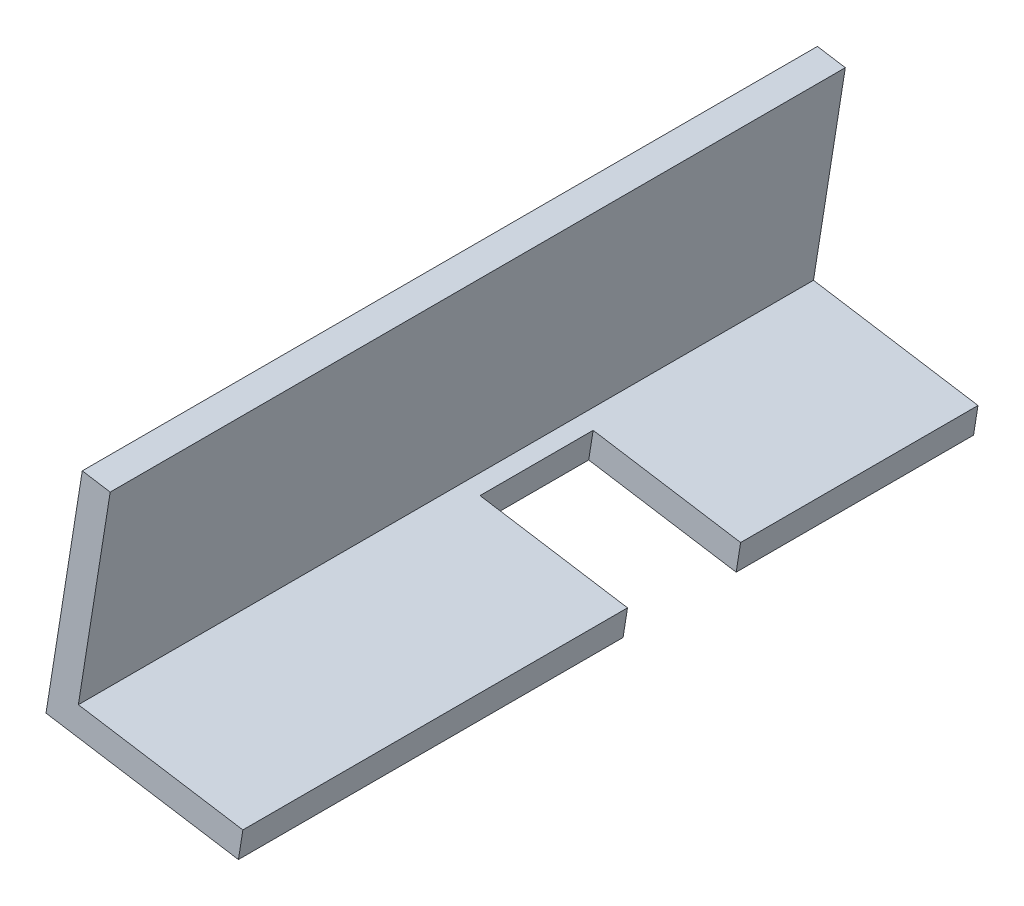
ISO-10303-21;
HEADER;
FILE_DESCRIPTION(('STEP AP214'),'2;1');
FILE_NAME('part.step','',(''),(''),'','','');
FILE_SCHEMA(('AUTOMOTIVE_DESIGN { 1 0 10303 214 1 1 1 1 }'));
ENDSEC;
DATA;
#1=APPLICATION_CONTEXT('core data for automotive mechanical design processes');
#2=APPLICATION_PROTOCOL_DEFINITION('international standard','automotive_design',2000,#1);
#3=PRODUCT_CONTEXT('',#1,'mechanical');
#4=PRODUCT('Part','Part','',(#3));
#5=PRODUCT_RELATED_PRODUCT_CATEGORY('part','',(#4));
#6=PRODUCT_DEFINITION_FORMATION('','',#4);
#7=PRODUCT_DEFINITION_CONTEXT('part definition',#1,'design');
#8=PRODUCT_DEFINITION('design','',#6,#7);
#9=PRODUCT_DEFINITION_SHAPE('','',#8);
#10=(LENGTH_UNIT() NAMED_UNIT(*) SI_UNIT(.MILLI.,.METRE.));
#11=(NAMED_UNIT(*) PLANE_ANGLE_UNIT() SI_UNIT($,.RADIAN.));
#12=(NAMED_UNIT(*) SI_UNIT($,.STERADIAN.) SOLID_ANGLE_UNIT());
#13=UNCERTAINTY_MEASURE_WITH_UNIT(LENGTH_MEASURE(1.E-05),#10,'distance_accuracy_value','');
#14=(GEOMETRIC_REPRESENTATION_CONTEXT(3) GLOBAL_UNCERTAINTY_ASSIGNED_CONTEXT((#13)) GLOBAL_UNIT_ASSIGNED_CONTEXT((#10,
#11,#12)) REPRESENTATION_CONTEXT('',''));
#15=CARTESIAN_POINT('',(0.,0.,0.));
#16=DIRECTION('',(0.,0.,1.));
#17=DIRECTION('',(1.,0.,0.));
#18=AXIS2_PLACEMENT_3D('',#15,#16,#17);
#19=CARTESIAN_POINT('',(160.5405547536,279.039764938732,-165.1));
#20=DIRECTION('',(0.987580260945618,-0.15711533404027,0.));
#21=DIRECTION('',(0.15711533404027,0.987580260945618,0.));
#22=AXIS2_PLACEMENT_3D('',#19,#20,#21);
#23=PLANE('',#22);
#24=DIRECTION('',(0.15711533404027,0.987580260945618,0.));
#25=VECTOR('',#24,1.);
#26=CARTESIAN_POINT('',(160.5405547536,279.039764938732,-111.788343442431));
#27=LINE('',#26,#25);
#28=CARTESIAN_POINT('',(160.5405547536,279.039764938732,-111.788343442431));
#29=VERTEX_POINT('',#28);
#30=CARTESIAN_POINT('',(161.538237124756,285.310899595737,-111.788343442431));
#31=VERTEX_POINT('',#30);
#32=EDGE_CURVE('E11',#29,#31,#27,.T.);
#33=ORIENTED_EDGE('',*,*,#32,.F.);
#34=DIRECTION('',(0.,0.,1.));
#35=VECTOR('',#34,1.);
#36=CARTESIAN_POINT('',(160.5405547536,279.039764938732,-165.1));
#37=LINE('',#36,#35);
#38=CARTESIAN_POINT('',(160.5405547536,279.039764938732,-165.1));
#39=VERTEX_POINT('',#38);
#40=EDGE_CURVE('E93',#39,#29,#37,.T.);
#41=ORIENTED_EDGE('',*,*,#40,.F.);
#42=DIRECTION('',(0.15711533404027,0.987580260945618,0.));
#43=VECTOR('',#42,1.);
#44=CARTESIAN_POINT('',(160.5405547536,279.039764938732,-165.1));
#45=LINE('',#44,#43);
#46=CARTESIAN_POINT('',(161.538237124756,285.310899595737,-165.1));
#47=VERTEX_POINT('',#46);
#48=EDGE_CURVE('E300',#39,#47,#45,.T.);
#49=ORIENTED_EDGE('',*,*,#48,.T.);
#50=DIRECTION('',(0.,0.,1.));
#51=VECTOR('',#50,1.);
#52=CARTESIAN_POINT('',(161.538237124756,285.310899595737,-165.1));
#53=LINE('',#52,#51);
#54=EDGE_CURVE('E165',#47,#31,#53,.T.);
#55=ORIENTED_EDGE('',*,*,#54,.T.);
#56=EDGE_LOOP('',(#33,#41,#49,#55));
#57=FACE_BOUND('',#56,.T.);
#58=ADVANCED_FACE('F32',(#57),#23,.T.);
#59=CARTESIAN_POINT('',(117.323698160328,285.91518674326,-165.1));
#60=DIRECTION('',(-0.157115334040368,-0.987580260945602,0.));
#61=DIRECTION('',(0.987580260945602,-0.157115334040368,0.));
#62=AXIS2_PLACEMENT_3D('',#59,#60,#61);
#63=PLANE('',#62);
#64=DIRECTION('',(0.987580260945602,-0.157115334040368,0.));
#65=VECTOR('',#64,1.);
#66=CARTESIAN_POINT('',(117.323698160328,285.91518674326,-111.788343442431));
#67=LINE('',#66,#65);
#68=CARTESIAN_POINT('',(127.420136774103,284.308932154997,-111.788343442431));
#69=VERTEX_POINT('',#68);
#70=EDGE_CURVE('E185',#69,#29,#67,.T.);
#71=ORIENTED_EDGE('',*,*,#70,.F.);
#72=DIRECTION('',(0.,0.,-1.));
#73=VECTOR('',#72,1.);
#74=CARTESIAN_POINT('',(127.420136774103,284.308932154997,-165.1));
#75=LINE('',#74,#73);
#76=CARTESIAN_POINT('',(127.420136774103,284.308932154997,-86.3883434424306));
#77=VERTEX_POINT('',#76);
#78=EDGE_CURVE('E144',#77,#69,#75,.T.);
#79=ORIENTED_EDGE('',*,*,#78,.F.);
#80=DIRECTION('',(-0.987580260945602,0.157115334040368,0.));
#81=VECTOR('',#80,1.);
#82=CARTESIAN_POINT('',(117.323698160328,285.91518674326,-86.3883434424306));
#83=LINE('',#82,#81);
#84=CARTESIAN_POINT('',(160.5405547536,279.039764938732,-86.3883434424306));
#85=VERTEX_POINT('',#84);
#86=EDGE_CURVE('E174',#85,#77,#83,.T.);
#87=ORIENTED_EDGE('',*,*,#86,.F.);
#88=CARTESIAN_POINT('',(160.5405547536,279.039764938732,0.));
#89=VERTEX_POINT('',#88);
#90=EDGE_CURVE('E139',#85,#89,#37,.T.);
#91=ORIENTED_EDGE('',*,*,#90,.T.);
#92=DIRECTION('',(0.987580260945602,-0.157115334040368,0.));
#93=VECTOR('',#92,1.);
#94=CARTESIAN_POINT('',(117.323698160328,285.91518674326,0.));
#95=LINE('',#94,#93);
#96=CARTESIAN_POINT('',(117.323698160328,285.91518674326,0.));
#97=VERTEX_POINT('',#96);
#98=EDGE_CURVE('E140',#97,#89,#95,.T.);
#99=ORIENTED_EDGE('',*,*,#98,.F.);
#100=DIRECTION('',(0.,0.,1.));
#101=VECTOR('',#100,1.);
#102=CARTESIAN_POINT('',(117.323698160328,285.91518674326,-165.1));
#103=LINE('',#102,#101);
#104=CARTESIAN_POINT('',(117.323698160328,285.91518674326,-165.1));
#105=VERTEX_POINT('',#104);
#106=EDGE_CURVE('E56',#105,#97,#103,.T.);
#107=ORIENTED_EDGE('',*,*,#106,.F.);
#108=DIRECTION('',(0.987580260945602,-0.157115334040368,0.));
#109=VECTOR('',#108,1.);
#110=CARTESIAN_POINT('',(117.323698160328,285.91518674326,-165.1));
#111=LINE('',#110,#109);
#112=EDGE_CURVE('E159',#105,#39,#111,.T.);
#113=ORIENTED_EDGE('',*,*,#112,.T.);
#114=ORIENTED_EDGE('',*,*,#40,.T.);
#115=EDGE_LOOP('',(#71,#79,#87,#91,#99,#107,#113,#114));
#116=FACE_BOUND('',#115,.T.);
#117=ADVANCED_FACE('F34',(#116),#63,.T.);
#118=CARTESIAN_POINT('',(118.321582589616,292.186289254593,-165.1));
#119=DIRECTION('',(-0.987575198122469,0.157147154137024,0.));
#120=DIRECTION('',(-0.157147154137024,-0.987575198122469,0.));
#121=AXIS2_PLACEMENT_3D('',#118,#119,#120);
#122=PLANE('',#121);
#123=DIRECTION('',(-0.157147154137024,-0.987575198122469,0.));
#124=VECTOR('',#123,1.);
#125=CARTESIAN_POINT('',(118.321582589616,292.186289254593,0.));
#126=LINE('',#125,#124);
#127=CARTESIAN_POINT('',(118.321582589616,292.186289254593,0.));
#128=VERTEX_POINT('',#127);
#129=EDGE_CURVE('E156',#128,#97,#126,.T.);
#130=ORIENTED_EDGE('',*,*,#129,.F.);
#131=DIRECTION('',(0.,0.,1.));
#132=VECTOR('',#131,1.);
#133=CARTESIAN_POINT('',(118.321582589616,292.186289254593,-165.1));
#134=LINE('',#133,#132);
#135=CARTESIAN_POINT('',(118.321582589616,292.186289254593,-165.1));
#136=VERTEX_POINT('',#135);
#137=EDGE_CURVE('E120',#136,#128,#134,.T.);
#138=ORIENTED_EDGE('',*,*,#137,.F.);
#139=DIRECTION('',(-0.157147154137024,-0.987575198122469,0.));
#140=VECTOR('',#139,1.);
#141=CARTESIAN_POINT('',(118.321582589616,292.186289254593,-165.1));
#142=LINE('',#141,#140);
#143=EDGE_CURVE('E129',#136,#105,#142,.T.);
#144=ORIENTED_EDGE('',*,*,#143,.T.);
#145=ORIENTED_EDGE('',*,*,#106,.T.);
#146=EDGE_LOOP('',(#130,#138,#144,#145));
#147=FACE_BOUND('',#146,.T.);
#148=ADVANCED_FACE('F192',(#147),#122,.T.);
#149=CARTESIAN_POINT('',(125.469495965379,337.114644597921,-165.1));
#150=DIRECTION('',(-0.987579554334892,0.157119775520765,0.));
#151=DIRECTION('',(-0.157119775520765,-0.987579554334892,0.));
#152=AXIS2_PLACEMENT_3D('',#149,#150,#151);
#153=PLANE('',#152);
#154=DIRECTION('',(-0.157119775520765,-0.987579554334892,0.));
#155=VECTOR('',#154,1.);
#156=CARTESIAN_POINT('',(125.469495965379,337.114644597921,0.));
#157=LINE('',#156,#155);
#158=CARTESIAN_POINT('',(125.469495965379,337.114644597921,0.));
#159=VERTEX_POINT('',#158);
#160=EDGE_CURVE('E115',#159,#128,#157,.T.);
#161=ORIENTED_EDGE('',*,*,#160,.F.);
#162=DIRECTION('',(0.,0.,1.));
#163=VECTOR('',#162,1.);
#164=CARTESIAN_POINT('',(125.469495965379,337.114644597921,-165.1));
#165=LINE('',#164,#163);
#166=CARTESIAN_POINT('',(125.469495965379,337.114644597921,-165.1));
#167=VERTEX_POINT('',#166);
#168=EDGE_CURVE('E109',#167,#159,#165,.T.);
#169=ORIENTED_EDGE('',*,*,#168,.F.);
#170=DIRECTION('',(-0.157119775520765,-0.987579554334892,0.));
#171=VECTOR('',#170,1.);
#172=CARTESIAN_POINT('',(125.469495965379,337.114644597921,-165.1));
#173=LINE('',#172,#171);
#174=EDGE_CURVE('E112',#167,#136,#173,.T.);
#175=ORIENTED_EDGE('',*,*,#174,.T.);
#176=ORIENTED_EDGE('',*,*,#137,.T.);
#177=EDGE_LOOP('',(#161,#169,#175,#176));
#178=FACE_BOUND('',#177,.T.);
#179=ADVANCED_FACE('F111',(#178),#153,.T.);
#180=CARTESIAN_POINT('',(131.740630622384,336.116962226764,-165.1));
#181=DIRECTION('',(0.157115334040352,0.987580260945605,0.));
#182=DIRECTION('',(-0.987580260945605,0.157115334040352,0.));
#183=AXIS2_PLACEMENT_3D('',#180,#181,#182);
#184=PLANE('',#183);
#185=DIRECTION('',(-0.987580260945605,0.157115334040352,0.));
#186=VECTOR('',#185,1.);
#187=CARTESIAN_POINT('',(131.740630622384,336.116962226764,0.));
#188=LINE('',#187,#186);
#189=CARTESIAN_POINT('',(131.740630622384,336.116962226764,0.));
#190=VERTEX_POINT('',#189);
#191=EDGE_CURVE('E153',#190,#159,#188,.T.);
#192=ORIENTED_EDGE('',*,*,#191,.F.);
#193=DIRECTION('',(0.,0.,1.));
#194=VECTOR('',#193,1.);
#195=CARTESIAN_POINT('',(131.740630622384,336.116962226764,-165.1));
#196=LINE('',#195,#194);
#197=CARTESIAN_POINT('',(131.740630622384,336.116962226764,-165.1));
#198=VERTEX_POINT('',#197);
#199=EDGE_CURVE('E121',#198,#190,#196,.T.);
#200=ORIENTED_EDGE('',*,*,#199,.F.);
#201=DIRECTION('',(-0.987580260945605,0.157115334040352,0.));
#202=VECTOR('',#201,1.);
#203=CARTESIAN_POINT('',(131.740630622384,336.116962226764,-165.1));
#204=LINE('',#203,#202);
#205=EDGE_CURVE('E127',#198,#167,#204,.T.);
#206=ORIENTED_EDGE('',*,*,#205,.T.);
#207=ORIENTED_EDGE('',*,*,#168,.T.);
#208=EDGE_LOOP('',(#192,#200,#206,#207));
#209=FACE_BOUND('',#208,.T.);
#210=ADVANCED_FACE('F131',(#209),#184,.T.);
#211=CARTESIAN_POINT('',(124.592919304753,291.188574737765,-165.1));
#212=DIRECTION('',(0.987580260945597,-0.157115334040398,0.));
#213=DIRECTION('',(0.157115334040398,0.987580260945598,0.));
#214=AXIS2_PLACEMENT_3D('',#211,#212,#213);
#215=PLANE('',#214);
#216=DIRECTION('',(0.157115334040398,0.987580260945597,0.));
#217=VECTOR('',#216,1.);
#218=CARTESIAN_POINT('',(124.592919304753,291.188574737765,0.));
#219=LINE('',#218,#217);
#220=CARTESIAN_POINT('',(124.592919304753,291.188574737765,0.));
#221=VERTEX_POINT('',#220);
#222=EDGE_CURVE('E150',#221,#190,#219,.T.);
#223=ORIENTED_EDGE('',*,*,#222,.F.);
#224=DIRECTION('',(0.,0.,1.));
#225=VECTOR('',#224,1.);
#226=CARTESIAN_POINT('',(124.592919304753,291.188574737765,-165.1));
#227=LINE('',#226,#225);
#228=CARTESIAN_POINT('',(124.592919304753,291.188574737765,-165.1));
#229=VERTEX_POINT('',#228);
#230=EDGE_CURVE('E163',#229,#221,#227,.T.);
#231=ORIENTED_EDGE('',*,*,#230,.F.);
#232=DIRECTION('',(0.157115334040398,0.987580260945597,0.));
#233=VECTOR('',#232,1.);
#234=CARTESIAN_POINT('',(124.592919304753,291.188574737765,-165.1));
#235=LINE('',#234,#233);
#236=EDGE_CURVE('E132',#229,#198,#235,.T.);
#237=ORIENTED_EDGE('',*,*,#236,.T.);
#238=ORIENTED_EDGE('',*,*,#199,.T.);
#239=EDGE_LOOP('',(#223,#231,#237,#238));
#240=FACE_BOUND('',#239,.T.);
#241=ADVANCED_FACE('F212',(#240),#215,.T.);
#242=CARTESIAN_POINT('',(161.538237124756,285.310899595737,-165.1));
#243=DIRECTION('',(0.157115334040372,0.987580260945601,0.));
#244=DIRECTION('',(-0.987580260945601,0.157115334040372,0.));
#245=AXIS2_PLACEMENT_3D('',#242,#243,#244);
#246=PLANE('',#245);
#247=DIRECTION('',(-0.987580260945602,0.157115334040372,0.));
#248=VECTOR('',#247,1.);
#249=CARTESIAN_POINT('',(128.41781914526,290.580066812002,-111.788343442431));
#250=LINE('',#249,#248);
#251=CARTESIAN_POINT('',(128.41781914526,290.580066812002,-111.788343442431));
#252=VERTEX_POINT('',#251);
#253=EDGE_CURVE('E313',#31,#252,#250,.T.);
#254=ORIENTED_EDGE('',*,*,#253,.F.);
#255=ORIENTED_EDGE('',*,*,#54,.F.);
#256=DIRECTION('',(-0.987580260945602,0.157115334040372,0.));
#257=VECTOR('',#256,1.);
#258=CARTESIAN_POINT('',(161.538237124756,285.310899595737,-165.1));
#259=LINE('',#258,#257);
#260=EDGE_CURVE('E134',#47,#229,#259,.T.);
#261=ORIENTED_EDGE('',*,*,#260,.T.);
#262=ORIENTED_EDGE('',*,*,#230,.T.);
#263=DIRECTION('',(-0.987580260945602,0.157115334040372,0.));
#264=VECTOR('',#263,1.);
#265=CARTESIAN_POINT('',(161.538237124756,285.310899595737,0.));
#266=LINE('',#265,#264);
#267=CARTESIAN_POINT('',(161.538237124756,285.310899595737,0.));
#268=VERTEX_POINT('',#267);
#269=EDGE_CURVE('E147',#268,#221,#266,.T.);
#270=ORIENTED_EDGE('',*,*,#269,.F.);
#271=CARTESIAN_POINT('',(161.538237124756,285.310899595737,-86.3883434424306));
#272=VERTEX_POINT('',#271);
#273=EDGE_CURVE('E168',#272,#268,#53,.T.);
#274=ORIENTED_EDGE('',*,*,#273,.F.);
#275=DIRECTION('',(0.987580260945602,-0.157115334040372,0.));
#276=VECTOR('',#275,1.);
#277=CARTESIAN_POINT('',(128.41781914526,290.580066812002,-86.3883434424306));
#278=LINE('',#277,#276);
#279=CARTESIAN_POINT('',(128.41781914526,290.580066812002,-86.3883434424306));
#280=VERTEX_POINT('',#279);
#281=EDGE_CURVE('E47',#280,#272,#278,.T.);
#282=ORIENTED_EDGE('',*,*,#281,.F.);
#283=DIRECTION('',(0.,0.,1.));
#284=VECTOR('',#283,1.);
#285=CARTESIAN_POINT('',(128.41781914526,290.580066812002,-111.788343442431));
#286=LINE('',#285,#284);
#287=EDGE_CURVE('E311',#252,#280,#286,.T.);
#288=ORIENTED_EDGE('',*,*,#287,.F.);
#289=EDGE_LOOP('',(#254,#255,#261,#262,#270,#274,#282,#288));
#290=FACE_BOUND('',#289,.T.);
#291=ADVANCED_FACE('F206',(#290),#246,.T.);
#292=DIRECTION('',(-0.15711533404027,-0.987580260945618,0.));
#293=VECTOR('',#292,1.);
#294=CARTESIAN_POINT('',(160.5405547536,279.039764938732,-86.3883434424306));
#295=LINE('',#294,#293);
#296=EDGE_CURVE('E40',#272,#85,#295,.T.);
#297=ORIENTED_EDGE('',*,*,#296,.F.);
#298=ORIENTED_EDGE('',*,*,#273,.T.);
#299=DIRECTION('',(0.15711533404027,0.987580260945618,0.));
#300=VECTOR('',#299,1.);
#301=CARTESIAN_POINT('',(160.5405547536,279.039764938732,0.));
#302=LINE('',#301,#300);
#303=EDGE_CURVE('E143',#89,#268,#302,.T.);
#304=ORIENTED_EDGE('',*,*,#303,.F.);
#305=ORIENTED_EDGE('',*,*,#90,.F.);
#306=EDGE_LOOP('',(#297,#298,#304,#305));
#307=FACE_BOUND('',#306,.T.);
#308=ADVANCED_FACE('F188',(#307),#23,.T.);
#309=CARTESIAN_POINT('',(160.5405547536,279.039764938732,-165.1));
#310=DIRECTION('',(0.,0.,1.));
#311=DIRECTION('',(1.,0.,0.));
#312=AXIS2_PLACEMENT_3D('',#309,#310,#311);
#313=PLANE('',#312);
#314=ORIENTED_EDGE('',*,*,#112,.F.);
#315=ORIENTED_EDGE('',*,*,#143,.F.);
#316=ORIENTED_EDGE('',*,*,#174,.F.);
#317=ORIENTED_EDGE('',*,*,#205,.F.);
#318=ORIENTED_EDGE('',*,*,#236,.F.);
#319=ORIENTED_EDGE('',*,*,#260,.F.);
#320=ORIENTED_EDGE('',*,*,#48,.F.);
#321=EDGE_LOOP('',(#314,#315,#316,#317,#318,#319,#320));
#322=FACE_BOUND('',#321,.T.);
#323=ADVANCED_FACE('F125',(#322),#313,.F.);
#324=CARTESIAN_POINT('',(160.5405547536,279.039764938732,0.));
#325=DIRECTION('',(0.,0.,1.));
#326=DIRECTION('',(1.,0.,0.));
#327=AXIS2_PLACEMENT_3D('',#324,#325,#326);
#328=PLANE('',#327);
#329=ORIENTED_EDGE('',*,*,#98,.T.);
#330=ORIENTED_EDGE('',*,*,#303,.T.);
#331=ORIENTED_EDGE('',*,*,#269,.T.);
#332=ORIENTED_EDGE('',*,*,#222,.T.);
#333=ORIENTED_EDGE('',*,*,#191,.T.);
#334=ORIENTED_EDGE('',*,*,#160,.T.);
#335=ORIENTED_EDGE('',*,*,#129,.T.);
#336=EDGE_LOOP('',(#329,#330,#331,#332,#333,#334,#335));
#337=FACE_BOUND('',#336,.T.);
#338=ADVANCED_FACE('F191',(#337),#328,.T.);
#339=CARTESIAN_POINT('',(126.353318807417,277.603231706621,-111.788343442431));
#340=DIRECTION('',(-0.987580260945601,0.157115334040372,0.));
#341=DIRECTION('',(-0.157115334040372,-0.987580260945602,0.));
#342=AXIS2_PLACEMENT_3D('',#339,#340,#341);
#343=PLANE('',#342);
#344=ORIENTED_EDGE('',*,*,#78,.T.);
#345=DIRECTION('',(0.157115334040372,0.987580260945601,0.));
#346=VECTOR('',#345,1.);
#347=CARTESIAN_POINT('',(126.353318807417,277.603231706621,-111.788343442431));
#348=LINE('',#347,#346);
#349=EDGE_CURVE('E186',#69,#252,#348,.T.);
#350=ORIENTED_EDGE('',*,*,#349,.T.);
#351=ORIENTED_EDGE('',*,*,#287,.T.);
#352=DIRECTION('',(0.157115334040372,0.987580260945601,0.));
#353=VECTOR('',#352,1.);
#354=CARTESIAN_POINT('',(126.353318807417,277.603231706621,-86.3883434424306));
#355=LINE('',#354,#353);
#356=EDGE_CURVE('E315',#77,#280,#355,.T.);
#357=ORIENTED_EDGE('',*,*,#356,.F.);
#358=EDGE_LOOP('',(#344,#350,#351,#357));
#359=FACE_BOUND('',#358,.T.);
#360=ADVANCED_FACE('F246',(#359),#343,.F.);
#361=CARTESIAN_POINT('',(126.353318807417,277.603231706621,-111.788343442431));
#362=DIRECTION('',(0.,0.,-1.));
#363=DIRECTION('',(-1.,0.,0.));
#364=AXIS2_PLACEMENT_3D('',#361,#362,#363);
#365=PLANE('',#364);
#366=ORIENTED_EDGE('',*,*,#70,.T.);
#367=ORIENTED_EDGE('',*,*,#32,.T.);
#368=ORIENTED_EDGE('',*,*,#253,.T.);
#369=ORIENTED_EDGE('',*,*,#349,.F.);
#370=EDGE_LOOP('',(#366,#367,#368,#369));
#371=FACE_BOUND('',#370,.T.);
#372=ADVANCED_FACE('F272',(#371),#365,.F.);
#373=CARTESIAN_POINT('',(126.353318807417,277.603231706621,-86.3883434424306));
#374=DIRECTION('',(0.,0.,1.));
#375=DIRECTION('',(1.,0.,0.));
#376=AXIS2_PLACEMENT_3D('',#373,#374,#375);
#377=PLANE('',#376);
#378=ORIENTED_EDGE('',*,*,#86,.T.);
#379=ORIENTED_EDGE('',*,*,#356,.T.);
#380=ORIENTED_EDGE('',*,*,#281,.T.);
#381=ORIENTED_EDGE('',*,*,#296,.T.);
#382=EDGE_LOOP('',(#378,#379,#380,#381));
#383=FACE_BOUND('',#382,.T.);
#384=ADVANCED_FACE('F172',(#383),#377,.F.);
#385=CLOSED_SHELL('',(#58,#117,#148,#179,#210,#241,#291,#308,#323,#338,#360,#372,#384));
#386=MANIFOLD_SOLID_BREP('B2',#385);
#387=ADVANCED_BREP_SHAPE_REPRESENTATION('',(#18,#386),#14);
#388=SHAPE_DEFINITION_REPRESENTATION(#9,#387);
ENDSEC;
END-ISO-10303-21;
